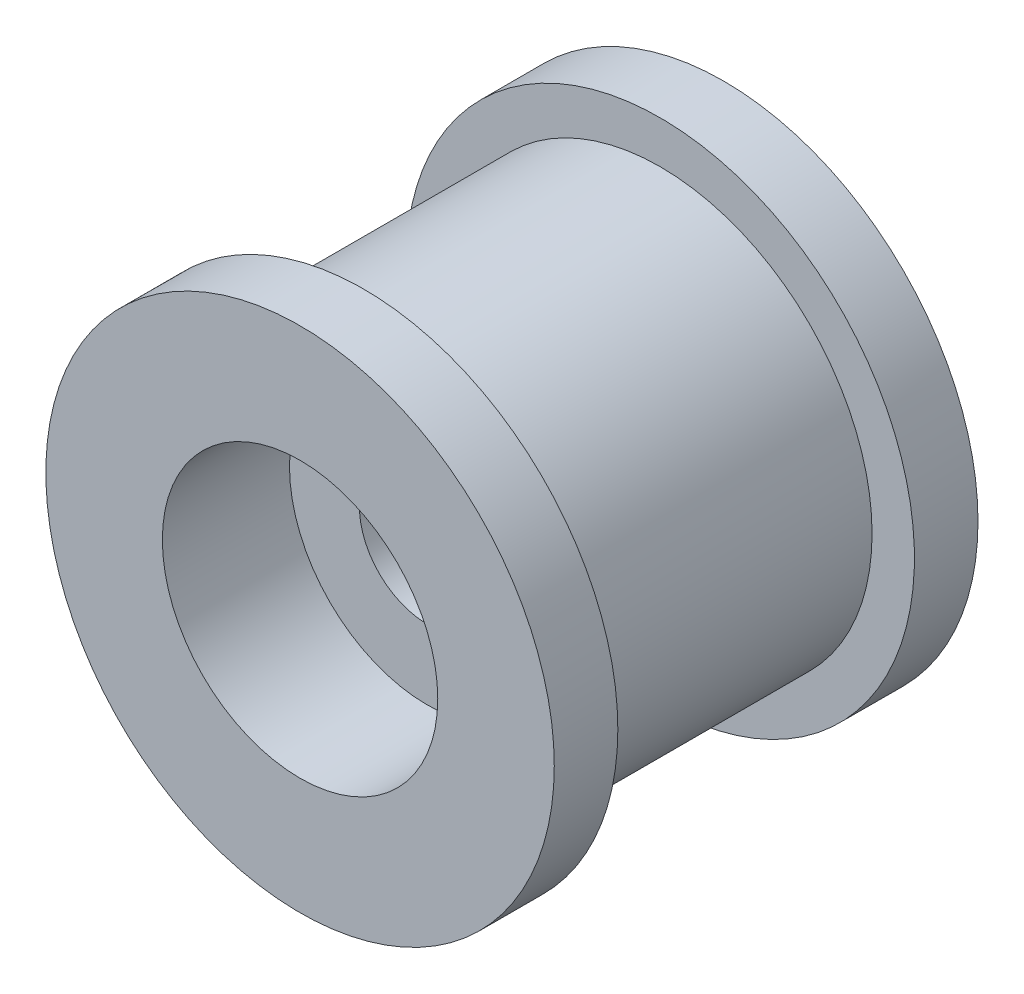
ISO-10303-21;
HEADER;
FILE_DESCRIPTION(('STEP AP214'),'2;1');
FILE_NAME('part.step','',(''),(''),'','','');
FILE_SCHEMA(('AUTOMOTIVE_DESIGN { 1 0 10303 214 1 1 1 1 }'));
ENDSEC;
DATA;
#1=APPLICATION_CONTEXT('core data for automotive mechanical design processes');
#2=APPLICATION_PROTOCOL_DEFINITION('international standard','automotive_design',2000,#1);
#3=PRODUCT_CONTEXT('',#1,'mechanical');
#4=PRODUCT('Part','Part','',(#3));
#5=PRODUCT_RELATED_PRODUCT_CATEGORY('part','',(#4));
#6=PRODUCT_DEFINITION_FORMATION('','',#4);
#7=PRODUCT_DEFINITION_CONTEXT('part definition',#1,'design');
#8=PRODUCT_DEFINITION('design','',#6,#7);
#9=PRODUCT_DEFINITION_SHAPE('','',#8);
#10=(LENGTH_UNIT() NAMED_UNIT(*) SI_UNIT(.MILLI.,.METRE.));
#11=(NAMED_UNIT(*) PLANE_ANGLE_UNIT() SI_UNIT($,.RADIAN.));
#12=(NAMED_UNIT(*) SI_UNIT($,.STERADIAN.) SOLID_ANGLE_UNIT());
#13=UNCERTAINTY_MEASURE_WITH_UNIT(LENGTH_MEASURE(1.E-05),#10,'distance_accuracy_value','');
#14=(GEOMETRIC_REPRESENTATION_CONTEXT(3) GLOBAL_UNCERTAINTY_ASSIGNED_CONTEXT((#13)) GLOBAL_UNIT_ASSIGNED_CONTEXT((#10,
#11,#12)) REPRESENTATION_CONTEXT('',''));
#15=CARTESIAN_POINT('',(0.,0.,0.));
#16=DIRECTION('',(0.,0.,1.));
#17=DIRECTION('',(1.,0.,0.));
#18=AXIS2_PLACEMENT_3D('',#15,#16,#17);
#19=CARTESIAN_POINT('',(0.,0.,10.));
#20=DIRECTION('',(0.,0.,-1.));
#21=DIRECTION('',(-1.,0.,0.));
#22=AXIS2_PLACEMENT_3D('',#19,#20,#21);
#23=CYLINDRICAL_SURFACE('',#22,1.6);
#24=CARTESIAN_POINT('',(0.,0.,0.));
#25=DIRECTION('',(0.,0.,1.));
#26=DIRECTION('',(1.,0.,0.));
#27=AXIS2_PLACEMENT_3D('',#24,#25,#26);
#28=CIRCLE('',#27,1.6);
#29=CARTESIAN_POINT('',(1.6,0.,0.));
#30=VERTEX_POINT('',#29);
#31=EDGE_CURVE('E44',#30,#30,#28,.T.);
#32=ORIENTED_EDGE('',*,*,#31,.F.);
#33=EDGE_LOOP('',(#32));
#34=FACE_BOUND('',#33,.T.);
#35=CARTESIAN_POINT('',(0.,0.,7.));
#36=DIRECTION('',(0.,0.,1.));
#37=DIRECTION('',(1.,0.,0.));
#38=AXIS2_PLACEMENT_3D('',#35,#36,#37);
#39=CIRCLE('',#38,1.6);
#40=CARTESIAN_POINT('',(1.6,0.,7.));
#41=VERTEX_POINT('',#40);
#42=EDGE_CURVE('E35',#41,#41,#39,.T.);
#43=ORIENTED_EDGE('',*,*,#42,.T.);
#44=EDGE_LOOP('',(#43));
#45=FACE_BOUND('',#44,.T.);
#46=ADVANCED_FACE('F31',(#34,#45),#23,.F.);
#47=CARTESIAN_POINT('',(0.,0.,10.));
#48=DIRECTION('',(0.,0.,-1.));
#49=DIRECTION('',(-1.,0.,0.));
#50=AXIS2_PLACEMENT_3D('',#47,#48,#49);
#51=CYLINDRICAL_SURFACE('',#50,6.);
#52=CARTESIAN_POINT('',(0.,0.,8.5));
#53=DIRECTION('',(0.,0.,1.));
#54=DIRECTION('',(1.,0.,0.));
#55=AXIS2_PLACEMENT_3D('',#52,#53,#54);
#56=CIRCLE('',#55,6.);
#57=CARTESIAN_POINT('',(6.,0.,8.5));
#58=VERTEX_POINT('',#57);
#59=EDGE_CURVE('E51',#58,#58,#56,.T.);
#60=ORIENTED_EDGE('',*,*,#59,.T.);
#61=EDGE_LOOP('',(#60));
#62=FACE_BOUND('',#61,.T.);
#63=CARTESIAN_POINT('',(0.,0.,10.));
#64=DIRECTION('',(0.,0.,1.));
#65=DIRECTION('',(1.,0.,0.));
#66=AXIS2_PLACEMENT_3D('',#63,#64,#65);
#67=CIRCLE('',#66,6.);
#68=CARTESIAN_POINT('',(6.,0.,10.));
#69=VERTEX_POINT('',#68);
#70=EDGE_CURVE('E10',#69,#69,#67,.T.);
#71=ORIENTED_EDGE('',*,*,#70,.F.);
#72=EDGE_LOOP('',(#71));
#73=FACE_BOUND('',#72,.T.);
#74=ADVANCED_FACE('F63',(#62,#73),#51,.T.);
#75=CARTESIAN_POINT('',(0.,0.,10.));
#76=DIRECTION('',(0.,0.,1.));
#77=DIRECTION('',(1.,0.,0.));
#78=AXIS2_PLACEMENT_3D('',#75,#76,#77);
#79=PLANE('',#78);
#80=CARTESIAN_POINT('',(0.,0.,10.));
#81=DIRECTION('',(0.,0.,1.));
#82=DIRECTION('',(1.,0.,0.));
#83=AXIS2_PLACEMENT_3D('',#80,#81,#82);
#84=CIRCLE('',#83,3.25);
#85=CARTESIAN_POINT('',(3.25,0.,10.));
#86=VERTEX_POINT('',#85);
#87=EDGE_CURVE('E73',#86,#86,#84,.T.);
#88=ORIENTED_EDGE('',*,*,#87,.F.);
#89=EDGE_LOOP('',(#88));
#90=FACE_BOUND('',#89,.T.);
#91=ORIENTED_EDGE('',*,*,#70,.T.);
#92=EDGE_LOOP('',(#91));
#93=FACE_BOUND('',#92,.T.);
#94=ADVANCED_FACE('F102',(#90,#93),#79,.T.);
#95=CARTESIAN_POINT('',(0.,0.,0.));
#96=DIRECTION('',(0.,0.,1.));
#97=DIRECTION('',(1.,0.,0.));
#98=AXIS2_PLACEMENT_3D('',#95,#96,#97);
#99=PLANE('',#98);
#100=CARTESIAN_POINT('',(0.,0.,0.));
#101=DIRECTION('',(0.,0.,1.));
#102=DIRECTION('',(1.,0.,0.));
#103=AXIS2_PLACEMENT_3D('',#100,#101,#102);
#104=CIRCLE('',#103,6.);
#105=CARTESIAN_POINT('',(6.,0.,0.));
#106=VERTEX_POINT('',#105);
#107=EDGE_CURVE('E39',#106,#106,#104,.T.);
#108=ORIENTED_EDGE('',*,*,#107,.F.);
#109=EDGE_LOOP('',(#108));
#110=FACE_BOUND('',#109,.T.);
#111=ORIENTED_EDGE('',*,*,#31,.T.);
#112=EDGE_LOOP('',(#111));
#113=FACE_BOUND('',#112,.T.);
#114=ADVANCED_FACE('F59',(#110,#113),#99,.F.);
#115=CARTESIAN_POINT('',(0.,0.,1.5));
#116=DIRECTION('',(0.,0.,-1.));
#117=DIRECTION('',(-1.,0.,0.));
#118=AXIS2_PLACEMENT_3D('',#115,#116,#117);
#119=CIRCLE('',#118,6.);
#120=CARTESIAN_POINT('',(-6.,0.,1.5));
#121=VERTEX_POINT('',#120);
#122=EDGE_CURVE('E49',#121,#121,#119,.T.);
#123=ORIENTED_EDGE('',*,*,#122,.T.);
#124=EDGE_LOOP('',(#123));
#125=FACE_BOUND('',#124,.T.);
#126=ORIENTED_EDGE('',*,*,#107,.T.);
#127=EDGE_LOOP('',(#126));
#128=FACE_BOUND('',#127,.T.);
#129=ADVANCED_FACE('F33',(#125,#128),#51,.T.);
#130=CARTESIAN_POINT('',(-6.33240776092464,0.,8.5));
#131=DIRECTION('',(0.,0.,1.));
#132=DIRECTION('',(1.,0.,0.));
#133=AXIS2_PLACEMENT_3D('',#130,#131,#132);
#134=PLANE('',#133);
#135=CARTESIAN_POINT('',(0.,0.,8.5));
#136=DIRECTION('',(0.,0.,-1.));
#137=DIRECTION('',(-1.,0.,0.));
#138=AXIS2_PLACEMENT_3D('',#135,#136,#137);
#139=CIRCLE('',#138,5.);
#140=CARTESIAN_POINT('',(-5.,0.,8.5));
#141=VERTEX_POINT('',#140);
#142=EDGE_CURVE('E52',#141,#141,#139,.T.);
#143=ORIENTED_EDGE('',*,*,#142,.F.);
#144=EDGE_LOOP('',(#143));
#145=FACE_BOUND('',#144,.T.);
#146=ORIENTED_EDGE('',*,*,#59,.F.);
#147=EDGE_LOOP('',(#146));
#148=FACE_BOUND('',#147,.T.);
#149=ADVANCED_FACE('F84',(#145,#148),#134,.F.);
#150=CARTESIAN_POINT('',(-6.33240776092464,0.,1.5));
#151=DIRECTION('',(0.,0.,-1.));
#152=DIRECTION('',(-1.,0.,0.));
#153=AXIS2_PLACEMENT_3D('',#150,#151,#152);
#154=PLANE('',#153);
#155=CARTESIAN_POINT('',(0.,0.,1.5));
#156=DIRECTION('',(0.,0.,-1.));
#157=DIRECTION('',(-1.,0.,0.));
#158=AXIS2_PLACEMENT_3D('',#155,#156,#157);
#159=CIRCLE('',#158,5.);
#160=CARTESIAN_POINT('',(-5.,0.,1.5));
#161=VERTEX_POINT('',#160);
#162=EDGE_CURVE('E68',#161,#161,#159,.T.);
#163=ORIENTED_EDGE('',*,*,#162,.T.);
#164=EDGE_LOOP('',(#163));
#165=FACE_BOUND('',#164,.T.);
#166=ORIENTED_EDGE('',*,*,#122,.F.);
#167=EDGE_LOOP('',(#166));
#168=FACE_BOUND('',#167,.T.);
#169=ADVANCED_FACE('F87',(#165,#168),#154,.F.);
#170=CARTESIAN_POINT('',(0.,0.,0.));
#171=DIRECTION('',(0.,0.,-1.));
#172=DIRECTION('',(-1.,0.,0.));
#173=AXIS2_PLACEMENT_3D('',#170,#171,#172);
#174=CYLINDRICAL_SURFACE('',#173,5.);
#175=ORIENTED_EDGE('',*,*,#162,.F.);
#176=EDGE_LOOP('',(#175));
#177=FACE_BOUND('',#176,.T.);
#178=ORIENTED_EDGE('',*,*,#142,.T.);
#179=EDGE_LOOP('',(#178));
#180=FACE_BOUND('',#179,.T.);
#181=ADVANCED_FACE('F82',(#177,#180),#174,.T.);
#182=CARTESIAN_POINT('',(0.,0.,7.));
#183=DIRECTION('',(0.,0.,1.));
#184=DIRECTION('',(1.,0.,0.));
#185=AXIS2_PLACEMENT_3D('',#182,#183,#184);
#186=CYLINDRICAL_SURFACE('',#185,3.25);
#187=CARTESIAN_POINT('',(0.,0.,7.));
#188=DIRECTION('',(0.,0.,1.));
#189=DIRECTION('',(1.,0.,0.));
#190=AXIS2_PLACEMENT_3D('',#187,#188,#189);
#191=CIRCLE('',#190,3.25);
#192=CARTESIAN_POINT('',(3.25,0.,7.));
#193=VERTEX_POINT('',#192);
#194=EDGE_CURVE('E69',#193,#193,#191,.T.);
#195=ORIENTED_EDGE('',*,*,#194,.F.);
#196=EDGE_LOOP('',(#195));
#197=FACE_BOUND('',#196,.T.);
#198=ORIENTED_EDGE('',*,*,#87,.T.);
#199=EDGE_LOOP('',(#198));
#200=FACE_BOUND('',#199,.T.);
#201=ADVANCED_FACE('F99',(#197,#200),#186,.F.);
#202=CARTESIAN_POINT('',(0.,0.,7.));
#203=DIRECTION('',(0.,0.,1.));
#204=DIRECTION('',(1.,0.,0.));
#205=AXIS2_PLACEMENT_3D('',#202,#203,#204);
#206=PLANE('',#205);
#207=ORIENTED_EDGE('',*,*,#42,.F.);
#208=EDGE_LOOP('',(#207));
#209=FACE_BOUND('',#208,.T.);
#210=ORIENTED_EDGE('',*,*,#194,.T.);
#211=EDGE_LOOP('',(#210));
#212=FACE_BOUND('',#211,.T.);
#213=ADVANCED_FACE('F156',(#209,#212),#206,.T.);
#214=CLOSED_SHELL('',(#46,#74,#94,#114,#129,#149,#169,#181,#201,#213));
#215=MANIFOLD_SOLID_BREP('B2',#214);
#216=ADVANCED_BREP_SHAPE_REPRESENTATION('',(#18,#215),#14);
#217=SHAPE_DEFINITION_REPRESENTATION(#9,#216);
ENDSEC;
END-ISO-10303-21;
